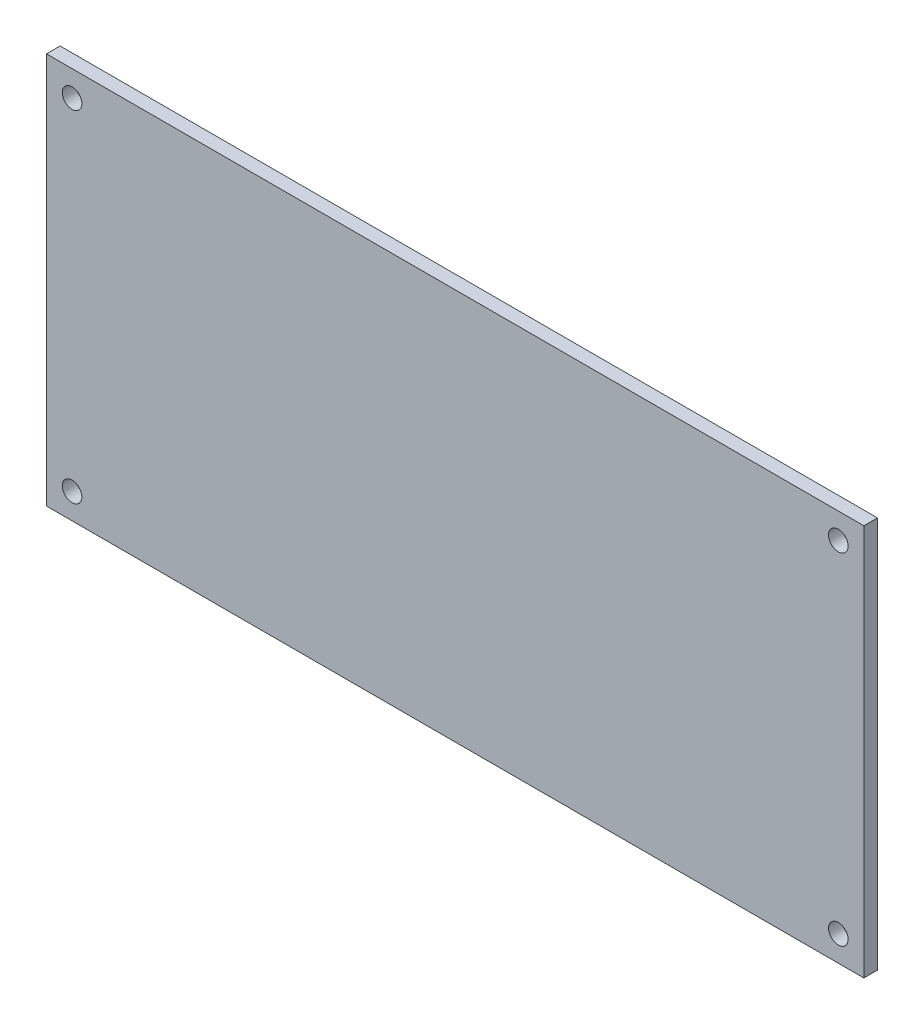
ISO-10303-21;
HEADER;
FILE_DESCRIPTION(('STEP AP214'),'2;1');
FILE_NAME('part.step','',(''),(''),'','','');
FILE_SCHEMA(('AUTOMOTIVE_DESIGN { 1 0 10303 214 1 1 1 1 }'));
ENDSEC;
DATA;
#1=APPLICATION_CONTEXT('core data for automotive mechanical design processes');
#2=APPLICATION_PROTOCOL_DEFINITION('international standard','automotive_design',2000,#1);
#3=PRODUCT_CONTEXT('',#1,'mechanical');
#4=PRODUCT('Part','Part','',(#3));
#5=PRODUCT_RELATED_PRODUCT_CATEGORY('part','',(#4));
#6=PRODUCT_DEFINITION_FORMATION('','',#4);
#7=PRODUCT_DEFINITION_CONTEXT('part definition',#1,'design');
#8=PRODUCT_DEFINITION('design','',#6,#7);
#9=PRODUCT_DEFINITION_SHAPE('','',#8);
#10=(LENGTH_UNIT() NAMED_UNIT(*) SI_UNIT(.MILLI.,.METRE.));
#11=(NAMED_UNIT(*) PLANE_ANGLE_UNIT() SI_UNIT($,.RADIAN.));
#12=(NAMED_UNIT(*) SI_UNIT($,.STERADIAN.) SOLID_ANGLE_UNIT());
#13=UNCERTAINTY_MEASURE_WITH_UNIT(LENGTH_MEASURE(1.E-05),#10,'distance_accuracy_value','');
#14=(GEOMETRIC_REPRESENTATION_CONTEXT(3) GLOBAL_UNCERTAINTY_ASSIGNED_CONTEXT((#13)) GLOBAL_UNIT_ASSIGNED_CONTEXT((#10,
#11,#12)) REPRESENTATION_CONTEXT('',''));
#15=CARTESIAN_POINT('',(0.,0.,0.));
#16=DIRECTION('',(0.,0.,1.));
#17=DIRECTION('',(1.,0.,0.));
#18=AXIS2_PLACEMENT_3D('',#15,#16,#17);
#19=CARTESIAN_POINT('',(0.,0.,1.6));
#20=DIRECTION('',(0.,0.,1.));
#21=DIRECTION('',(1.,0.,0.));
#22=AXIS2_PLACEMENT_3D('',#19,#20,#21);
#23=PLANE('',#22);
#24=CARTESIAN_POINT('',(-45.,-20.,1.6));
#25=DIRECTION('',(0.,0.,1.));
#26=DIRECTION('',(-1.,0.,0.));
#27=AXIS2_PLACEMENT_3D('',#24,#25,#26);
#28=CIRCLE('',#27,1.15);
#29=CARTESIAN_POINT('',(-46.15,-20.,1.6));
#30=VERTEX_POINT('',#29);
#31=EDGE_CURVE('E120',#30,#30,#28,.T.);
#32=ORIENTED_EDGE('',*,*,#31,.F.);
#33=EDGE_LOOP('',(#32));
#34=FACE_BOUND('',#33,.T.);
#35=CARTESIAN_POINT('',(45.,20.,1.6));
#36=DIRECTION('',(0.,0.,1.));
#37=DIRECTION('',(-1.,0.,0.));
#38=AXIS2_PLACEMENT_3D('',#35,#36,#37);
#39=CIRCLE('',#38,1.15);
#40=CARTESIAN_POINT('',(43.85,20.,1.6));
#41=VERTEX_POINT('',#40);
#42=EDGE_CURVE('E99',#41,#41,#39,.T.);
#43=ORIENTED_EDGE('',*,*,#42,.F.);
#44=EDGE_LOOP('',(#43));
#45=FACE_BOUND('',#44,.T.);
#46=DIRECTION('',(0.,-1.,0.));
#47=VECTOR('',#46,1.);
#48=CARTESIAN_POINT('',(-48.,23.,1.6));
#49=LINE('',#48,#47);
#50=CARTESIAN_POINT('',(-48.,23.,1.6));
#51=VERTEX_POINT('',#50);
#52=CARTESIAN_POINT('',(-48.,-23.,1.6));
#53=VERTEX_POINT('',#52);
#54=EDGE_CURVE('E84',#51,#53,#49,.T.);
#55=ORIENTED_EDGE('',*,*,#54,.T.);
#56=DIRECTION('',(1.,0.,0.));
#57=VECTOR('',#56,1.);
#58=CARTESIAN_POINT('',(-48.,-23.,1.6));
#59=LINE('',#58,#57);
#60=CARTESIAN_POINT('',(48.,-23.,1.6));
#61=VERTEX_POINT('',#60);
#62=EDGE_CURVE('E79',#53,#61,#59,.T.);
#63=ORIENTED_EDGE('',*,*,#62,.T.);
#64=DIRECTION('',(0.,1.,0.));
#65=VECTOR('',#64,1.);
#66=CARTESIAN_POINT('',(48.,23.,1.6));
#67=LINE('',#66,#65);
#68=CARTESIAN_POINT('',(48.,23.,1.6));
#69=VERTEX_POINT('',#68);
#70=EDGE_CURVE('E82',#61,#69,#67,.T.);
#71=ORIENTED_EDGE('',*,*,#70,.T.);
#72=DIRECTION('',(-1.,0.,0.));
#73=VECTOR('',#72,1.);
#74=CARTESIAN_POINT('',(-48.,23.,1.6));
#75=LINE('',#74,#73);
#76=EDGE_CURVE('E49',#69,#51,#75,.T.);
#77=ORIENTED_EDGE('',*,*,#76,.T.);
#78=EDGE_LOOP('',(#55,#63,#71,#77));
#79=FACE_BOUND('',#78,.T.);
#80=CARTESIAN_POINT('',(-45.,20.,1.6));
#81=DIRECTION('',(0.,0.,1.));
#82=DIRECTION('',(1.,0.,0.));
#83=AXIS2_PLACEMENT_3D('',#80,#81,#82);
#84=CIRCLE('',#83,1.15);
#85=CARTESIAN_POINT('',(-43.85,20.,1.6));
#86=VERTEX_POINT('',#85);
#87=EDGE_CURVE('E114',#86,#86,#84,.T.);
#88=ORIENTED_EDGE('',*,*,#87,.F.);
#89=EDGE_LOOP('',(#88));
#90=FACE_BOUND('',#89,.T.);
#91=CARTESIAN_POINT('',(45.,-20.,1.6));
#92=DIRECTION('',(0.,0.,1.));
#93=DIRECTION('',(1.,0.,0.));
#94=AXIS2_PLACEMENT_3D('',#91,#92,#93);
#95=CIRCLE('',#94,1.15);
#96=CARTESIAN_POINT('',(46.15,-20.,1.6));
#97=VERTEX_POINT('',#96);
#98=EDGE_CURVE('E126',#97,#97,#95,.T.);
#99=ORIENTED_EDGE('',*,*,#98,.F.);
#100=EDGE_LOOP('',(#99));
#101=FACE_BOUND('',#100,.T.);
#102=ADVANCED_FACE('F32',(#34,#45,#79,#90,#101),#23,.T.);
#103=CARTESIAN_POINT('',(0.,0.,0.));
#104=DIRECTION('',(0.,0.,1.));
#105=DIRECTION('',(1.,0.,0.));
#106=AXIS2_PLACEMENT_3D('',#103,#104,#105);
#107=PLANE('',#106);
#108=DIRECTION('',(0.,-1.,0.));
#109=VECTOR('',#108,1.);
#110=CARTESIAN_POINT('',(-48.,23.,0.));
#111=LINE('',#110,#109);
#112=CARTESIAN_POINT('',(-48.,23.,0.));
#113=VERTEX_POINT('',#112);
#114=CARTESIAN_POINT('',(-48.,-23.,0.));
#115=VERTEX_POINT('',#114);
#116=EDGE_CURVE('E96',#113,#115,#111,.T.);
#117=ORIENTED_EDGE('',*,*,#116,.F.);
#118=DIRECTION('',(-1.,0.,0.));
#119=VECTOR('',#118,1.);
#120=CARTESIAN_POINT('',(-48.,23.,0.));
#121=LINE('',#120,#119);
#122=CARTESIAN_POINT('',(48.,23.,0.));
#123=VERTEX_POINT('',#122);
#124=EDGE_CURVE('E72',#123,#113,#121,.T.);
#125=ORIENTED_EDGE('',*,*,#124,.F.);
#126=DIRECTION('',(0.,1.,0.));
#127=VECTOR('',#126,1.);
#128=CARTESIAN_POINT('',(48.,23.,0.));
#129=LINE('',#128,#127);
#130=CARTESIAN_POINT('',(48.,-23.,0.));
#131=VERTEX_POINT('',#130);
#132=EDGE_CURVE('E66',#131,#123,#129,.T.);
#133=ORIENTED_EDGE('',*,*,#132,.F.);
#134=DIRECTION('',(1.,0.,0.));
#135=VECTOR('',#134,1.);
#136=CARTESIAN_POINT('',(-48.,-23.,0.));
#137=LINE('',#136,#135);
#138=EDGE_CURVE('E88',#115,#131,#137,.T.);
#139=ORIENTED_EDGE('',*,*,#138,.F.);
#140=EDGE_LOOP('',(#117,#125,#133,#139));
#141=FACE_BOUND('',#140,.T.);
#142=CARTESIAN_POINT('',(45.,20.,0.));
#143=DIRECTION('',(0.,0.,1.));
#144=DIRECTION('',(-1.,0.,0.));
#145=AXIS2_PLACEMENT_3D('',#142,#143,#144);
#146=CIRCLE('',#145,1.15);
#147=CARTESIAN_POINT('',(43.85,20.,0.));
#148=VERTEX_POINT('',#147);
#149=EDGE_CURVE('E111',#148,#148,#146,.T.);
#150=ORIENTED_EDGE('',*,*,#149,.T.);
#151=EDGE_LOOP('',(#150));
#152=FACE_BOUND('',#151,.T.);
#153=CARTESIAN_POINT('',(-45.,20.,0.));
#154=DIRECTION('',(0.,0.,1.));
#155=DIRECTION('',(1.,0.,0.));
#156=AXIS2_PLACEMENT_3D('',#153,#154,#155);
#157=CIRCLE('',#156,1.15);
#158=CARTESIAN_POINT('',(-43.85,20.,0.));
#159=VERTEX_POINT('',#158);
#160=EDGE_CURVE('E117',#159,#159,#157,.T.);
#161=ORIENTED_EDGE('',*,*,#160,.T.);
#162=EDGE_LOOP('',(#161));
#163=FACE_BOUND('',#162,.T.);
#164=CARTESIAN_POINT('',(-45.,-20.,0.));
#165=DIRECTION('',(0.,0.,1.));
#166=DIRECTION('',(-1.,0.,0.));
#167=AXIS2_PLACEMENT_3D('',#164,#165,#166);
#168=CIRCLE('',#167,1.15);
#169=CARTESIAN_POINT('',(-46.15,-20.,0.));
#170=VERTEX_POINT('',#169);
#171=EDGE_CURVE('E123',#170,#170,#168,.T.);
#172=ORIENTED_EDGE('',*,*,#171,.T.);
#173=EDGE_LOOP('',(#172));
#174=FACE_BOUND('',#173,.T.);
#175=CARTESIAN_POINT('',(45.,-20.,0.));
#176=DIRECTION('',(0.,0.,1.));
#177=DIRECTION('',(1.,0.,0.));
#178=AXIS2_PLACEMENT_3D('',#175,#176,#177);
#179=CIRCLE('',#178,1.15);
#180=CARTESIAN_POINT('',(46.15,-20.,0.));
#181=VERTEX_POINT('',#180);
#182=EDGE_CURVE('E129',#181,#181,#179,.T.);
#183=ORIENTED_EDGE('',*,*,#182,.T.);
#184=EDGE_LOOP('',(#183));
#185=FACE_BOUND('',#184,.T.);
#186=ADVANCED_FACE('F107',(#141,#152,#163,#174,#185),#107,.F.);
#187=CARTESIAN_POINT('',(-48.,23.,1.6));
#188=DIRECTION('',(1.,0.,0.));
#189=DIRECTION('',(0.,1.,0.));
#190=AXIS2_PLACEMENT_3D('',#187,#188,#189);
#191=PLANE('',#190);
#192=ORIENTED_EDGE('',*,*,#116,.T.);
#193=DIRECTION('',(0.,0.,-1.));
#194=VECTOR('',#193,1.);
#195=CARTESIAN_POINT('',(-48.,-23.,1.6));
#196=LINE('',#195,#194);
#197=EDGE_CURVE('E11',#53,#115,#196,.T.);
#198=ORIENTED_EDGE('',*,*,#197,.F.);
#199=ORIENTED_EDGE('',*,*,#54,.F.);
#200=DIRECTION('',(0.,0.,-1.));
#201=VECTOR('',#200,1.);
#202=CARTESIAN_POINT('',(-48.,23.,1.6));
#203=LINE('',#202,#201);
#204=EDGE_CURVE('E92',#51,#113,#203,.T.);
#205=ORIENTED_EDGE('',*,*,#204,.T.);
#206=EDGE_LOOP('',(#192,#198,#199,#205));
#207=FACE_BOUND('',#206,.T.);
#208=ADVANCED_FACE('F34',(#207),#191,.F.);
#209=CARTESIAN_POINT('',(-48.,-23.,1.6));
#210=DIRECTION('',(0.,1.,0.));
#211=DIRECTION('',(0.,0.,1.));
#212=AXIS2_PLACEMENT_3D('',#209,#210,#211);
#213=PLANE('',#212);
#214=ORIENTED_EDGE('',*,*,#138,.T.);
#215=DIRECTION('',(0.,0.,-1.));
#216=VECTOR('',#215,1.);
#217=CARTESIAN_POINT('',(48.,-23.,1.6));
#218=LINE('',#217,#216);
#219=EDGE_CURVE('E41',#61,#131,#218,.T.);
#220=ORIENTED_EDGE('',*,*,#219,.F.);
#221=ORIENTED_EDGE('',*,*,#62,.F.);
#222=ORIENTED_EDGE('',*,*,#197,.T.);
#223=EDGE_LOOP('',(#214,#220,#221,#222));
#224=FACE_BOUND('',#223,.T.);
#225=ADVANCED_FACE('F87',(#224),#213,.F.);
#226=CARTESIAN_POINT('',(48.,23.,1.6));
#227=DIRECTION('',(-1.,0.,0.));
#228=DIRECTION('',(0.,-1.,0.));
#229=AXIS2_PLACEMENT_3D('',#226,#227,#228);
#230=PLANE('',#229);
#231=ORIENTED_EDGE('',*,*,#132,.T.);
#232=DIRECTION('',(0.,0.,-1.));
#233=VECTOR('',#232,1.);
#234=CARTESIAN_POINT('',(48.,23.,1.6));
#235=LINE('',#234,#233);
#236=EDGE_CURVE('E89',#69,#123,#235,.T.);
#237=ORIENTED_EDGE('',*,*,#236,.F.);
#238=ORIENTED_EDGE('',*,*,#70,.F.);
#239=ORIENTED_EDGE('',*,*,#219,.T.);
#240=EDGE_LOOP('',(#231,#237,#238,#239));
#241=FACE_BOUND('',#240,.T.);
#242=ADVANCED_FACE('F90',(#241),#230,.F.);
#243=CARTESIAN_POINT('',(-48.,23.,1.6));
#244=DIRECTION('',(0.,-1.,0.));
#245=DIRECTION('',(0.,0.,-1.));
#246=AXIS2_PLACEMENT_3D('',#243,#244,#245);
#247=PLANE('',#246);
#248=ORIENTED_EDGE('',*,*,#124,.T.);
#249=ORIENTED_EDGE('',*,*,#204,.F.);
#250=ORIENTED_EDGE('',*,*,#76,.F.);
#251=ORIENTED_EDGE('',*,*,#236,.T.);
#252=EDGE_LOOP('',(#248,#249,#250,#251));
#253=FACE_BOUND('',#252,.T.);
#254=ADVANCED_FACE('F104',(#253),#247,.F.);
#255=CARTESIAN_POINT('',(45.,20.,1.6));
#256=DIRECTION('',(0.,0.,-1.));
#257=DIRECTION('',(-1.,0.,0.));
#258=AXIS2_PLACEMENT_3D('',#255,#256,#257);
#259=CYLINDRICAL_SURFACE('',#258,1.15);
#260=ORIENTED_EDGE('',*,*,#42,.T.);
#261=EDGE_LOOP('',(#260));
#262=FACE_BOUND('',#261,.T.);
#263=ORIENTED_EDGE('',*,*,#149,.F.);
#264=EDGE_LOOP('',(#263));
#265=FACE_BOUND('',#264,.T.);
#266=ADVANCED_FACE('F148',(#262,#265),#259,.F.);
#267=CARTESIAN_POINT('',(-45.,20.,1.6));
#268=DIRECTION('',(0.,0.,-1.));
#269=DIRECTION('',(-1.,0.,0.));
#270=AXIS2_PLACEMENT_3D('',#267,#268,#269);
#271=CYLINDRICAL_SURFACE('',#270,1.15);
#272=ORIENTED_EDGE('',*,*,#87,.T.);
#273=EDGE_LOOP('',(#272));
#274=FACE_BOUND('',#273,.T.);
#275=ORIENTED_EDGE('',*,*,#160,.F.);
#276=EDGE_LOOP('',(#275));
#277=FACE_BOUND('',#276,.T.);
#278=ADVANCED_FACE('F194',(#274,#277),#271,.F.);
#279=CARTESIAN_POINT('',(-45.,-20.,1.6));
#280=DIRECTION('',(0.,0.,-1.));
#281=DIRECTION('',(-1.,0.,0.));
#282=AXIS2_PLACEMENT_3D('',#279,#280,#281);
#283=CYLINDRICAL_SURFACE('',#282,1.15);
#284=ORIENTED_EDGE('',*,*,#31,.T.);
#285=EDGE_LOOP('',(#284));
#286=FACE_BOUND('',#285,.T.);
#287=ORIENTED_EDGE('',*,*,#171,.F.);
#288=EDGE_LOOP('',(#287));
#289=FACE_BOUND('',#288,.T.);
#290=ADVANCED_FACE('F202',(#286,#289),#283,.F.);
#291=CARTESIAN_POINT('',(45.,-20.,1.6));
#292=DIRECTION('',(0.,0.,-1.));
#293=DIRECTION('',(-1.,0.,0.));
#294=AXIS2_PLACEMENT_3D('',#291,#292,#293);
#295=CYLINDRICAL_SURFACE('',#294,1.15);
#296=ORIENTED_EDGE('',*,*,#98,.T.);
#297=EDGE_LOOP('',(#296));
#298=FACE_BOUND('',#297,.T.);
#299=ORIENTED_EDGE('',*,*,#182,.F.);
#300=EDGE_LOOP('',(#299));
#301=FACE_BOUND('',#300,.T.);
#302=ADVANCED_FACE('F135',(#298,#301),#295,.F.);
#303=CLOSED_SHELL('',(#102,#186,#208,#225,#242,#254,#266,#278,#290,#302));
#304=MANIFOLD_SOLID_BREP('B2',#303);
#305=ADVANCED_BREP_SHAPE_REPRESENTATION('',(#18,#304),#14);
#306=SHAPE_DEFINITION_REPRESENTATION(#9,#305);
ENDSEC;
END-ISO-10303-21;
